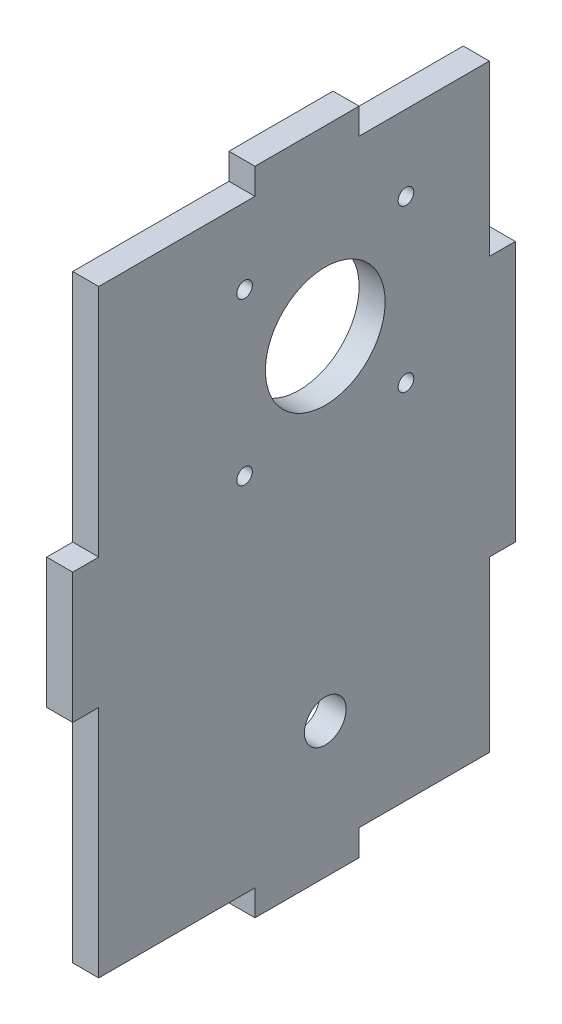
ISO-10303-21;
HEADER;
FILE_DESCRIPTION(('STEP AP214'),'2;1');
FILE_NAME('part.step','',(''),(''),'','','');
FILE_SCHEMA(('AUTOMOTIVE_DESIGN { 1 0 10303 214 1 1 1 1 }'));
ENDSEC;
DATA;
#1=APPLICATION_CONTEXT('core data for automotive mechanical design processes');
#2=APPLICATION_PROTOCOL_DEFINITION('international standard','automotive_design',2000,#1);
#3=PRODUCT_CONTEXT('',#1,'mechanical');
#4=PRODUCT('Part','Part','',(#3));
#5=PRODUCT_RELATED_PRODUCT_CATEGORY('part','',(#4));
#6=PRODUCT_DEFINITION_FORMATION('','',#4);
#7=PRODUCT_DEFINITION_CONTEXT('part definition',#1,'design');
#8=PRODUCT_DEFINITION('design','',#6,#7);
#9=PRODUCT_DEFINITION_SHAPE('','',#8);
#10=(LENGTH_UNIT() NAMED_UNIT(*) SI_UNIT(.MILLI.,.METRE.));
#11=(NAMED_UNIT(*) PLANE_ANGLE_UNIT() SI_UNIT($,.RADIAN.));
#12=(NAMED_UNIT(*) SI_UNIT($,.STERADIAN.) SOLID_ANGLE_UNIT());
#13=UNCERTAINTY_MEASURE_WITH_UNIT(LENGTH_MEASURE(1.E-05),#10,'distance_accuracy_value','');
#14=(GEOMETRIC_REPRESENTATION_CONTEXT(3) GLOBAL_UNCERTAINTY_ASSIGNED_CONTEXT((#13)) GLOBAL_UNIT_ASSIGNED_CONTEXT((#10,
#11,#12)) REPRESENTATION_CONTEXT('',''));
#15=CARTESIAN_POINT('',(0.,0.,0.));
#16=DIRECTION('',(0.,0.,1.));
#17=DIRECTION('',(1.,0.,0.));
#18=AXIS2_PLACEMENT_3D('',#15,#16,#17);
#19=CARTESIAN_POINT('',(5.,0.,0.));
#20=DIRECTION('',(-1.,0.,0.));
#21=DIRECTION('',(0.,0.,1.));
#22=AXIS2_PLACEMENT_3D('',#19,#20,#21);
#23=PLANE('',#22);
#24=DIRECTION('',(0.,0.,1.));
#25=VECTOR('',#24,1.);
#26=CARTESIAN_POINT('',(5.,115.,50.));
#27=LINE('',#26,#25);
#28=CARTESIAN_POINT('',(5.,115.,50.));
#29=VERTEX_POINT('',#28);
#30=CARTESIAN_POINT('',(5.,115.,80.));
#31=VERTEX_POINT('',#30);
#32=EDGE_CURVE('E242',#29,#31,#27,.T.);
#33=ORIENTED_EDGE('',*,*,#32,.T.);
#34=DIRECTION('',(0.,-1.,0.));
#35=VECTOR('',#34,1.);
#36=CARTESIAN_POINT('',(5.,70.,80.));
#37=LINE('',#36,#35);
#38=CARTESIAN_POINT('',(5.,70.,80.));
#39=VERTEX_POINT('',#38);
#40=EDGE_CURVE('E130',#31,#39,#37,.T.);
#41=ORIENTED_EDGE('',*,*,#40,.T.);
#42=DIRECTION('',(0.,0.,1.));
#43=VECTOR('',#42,1.);
#44=CARTESIAN_POINT('',(5.,70.,80.));
#45=LINE('',#44,#43);
#46=CARTESIAN_POINT('',(5.,70.,85.));
#47=VERTEX_POINT('',#46);
#48=EDGE_CURVE('E293',#39,#47,#45,.T.);
#49=ORIENTED_EDGE('',*,*,#48,.T.);
#50=DIRECTION('',(0.,-1.,0.));
#51=VECTOR('',#50,1.);
#52=CARTESIAN_POINT('',(5.,70.,85.));
#53=LINE('',#52,#51);
#54=CARTESIAN_POINT('',(5.,45.,85.));
#55=VERTEX_POINT('',#54);
#56=EDGE_CURVE('E312',#47,#55,#53,.T.);
#57=ORIENTED_EDGE('',*,*,#56,.T.);
#58=DIRECTION('',(0.,0.,-1.));
#59=VECTOR('',#58,1.);
#60=CARTESIAN_POINT('',(5.,45.,80.));
#61=LINE('',#60,#59);
#62=CARTESIAN_POINT('',(5.,45.,80.));
#63=VERTEX_POINT('',#62);
#64=EDGE_CURVE('E309',#55,#63,#61,.T.);
#65=ORIENTED_EDGE('',*,*,#64,.T.);
#66=DIRECTION('',(0.,-1.,0.));
#67=VECTOR('',#66,1.);
#68=CARTESIAN_POINT('',(5.,0.,80.));
#69=LINE('',#68,#67);
#70=CARTESIAN_POINT('',(5.,0.,80.));
#71=VERTEX_POINT('',#70);
#72=EDGE_CURVE('E311',#63,#71,#69,.T.);
#73=ORIENTED_EDGE('',*,*,#72,.T.);
#74=DIRECTION('',(0.,0.,-1.));
#75=VECTOR('',#74,1.);
#76=CARTESIAN_POINT('',(5.,0.,50.));
#77=LINE('',#76,#75);
#78=CARTESIAN_POINT('',(5.,0.,50.));
#79=VERTEX_POINT('',#78);
#80=EDGE_CURVE('E314',#71,#79,#77,.T.);
#81=ORIENTED_EDGE('',*,*,#80,.T.);
#82=DIRECTION('',(0.,-1.,0.));
#83=VECTOR('',#82,1.);
#84=CARTESIAN_POINT('',(5.,0.,50.));
#85=LINE('',#84,#83);
#86=CARTESIAN_POINT('',(5.,-5.,50.));
#87=VERTEX_POINT('',#86);
#88=EDGE_CURVE('E320',#79,#87,#85,.T.);
#89=ORIENTED_EDGE('',*,*,#88,.T.);
#90=DIRECTION('',(0.,0.,-1.));
#91=VECTOR('',#90,1.);
#92=CARTESIAN_POINT('',(5.,-5.,30.));
#93=LINE('',#92,#91);
#94=CARTESIAN_POINT('',(5.,-5.,30.));
#95=VERTEX_POINT('',#94);
#96=EDGE_CURVE('E322',#87,#95,#93,.T.);
#97=ORIENTED_EDGE('',*,*,#96,.T.);
#98=DIRECTION('',(0.,1.,0.));
#99=VECTOR('',#98,1.);
#100=CARTESIAN_POINT('',(5.,0.,30.));
#101=LINE('',#100,#99);
#102=CARTESIAN_POINT('',(5.,0.,30.));
#103=VERTEX_POINT('',#102);
#104=EDGE_CURVE('E324',#95,#103,#101,.T.);
#105=ORIENTED_EDGE('',*,*,#104,.T.);
#106=DIRECTION('',(0.,0.,-1.));
#107=VECTOR('',#106,1.);
#108=CARTESIAN_POINT('',(5.,0.,4.99999999999999));
#109=LINE('',#108,#107);
#110=CARTESIAN_POINT('',(5.,0.,4.99999999999999));
#111=VERTEX_POINT('',#110);
#112=EDGE_CURVE('E326',#103,#111,#109,.T.);
#113=ORIENTED_EDGE('',*,*,#112,.T.);
#114=DIRECTION('',(0.,1.,0.));
#115=VECTOR('',#114,1.);
#116=CARTESIAN_POINT('',(5.,32.5,5.));
#117=LINE('',#116,#115);
#118=CARTESIAN_POINT('',(5.,32.5,5.));
#119=VERTEX_POINT('',#118);
#120=EDGE_CURVE('E328',#111,#119,#117,.T.);
#121=ORIENTED_EDGE('',*,*,#120,.T.);
#122=DIRECTION('',(0.,0.,-1.));
#123=VECTOR('',#122,1.);
#124=CARTESIAN_POINT('',(5.,32.5,0.));
#125=LINE('',#124,#123);
#126=CARTESIAN_POINT('',(5.,32.5,0.));
#127=VERTEX_POINT('',#126);
#128=EDGE_CURVE('E330',#119,#127,#125,.T.);
#129=ORIENTED_EDGE('',*,*,#128,.T.);
#130=DIRECTION('',(0.,1.,0.));
#131=VECTOR('',#130,1.);
#132=CARTESIAN_POINT('',(5.,32.5,0.));
#133=LINE('',#132,#131);
#134=CARTESIAN_POINT('',(5.,82.5,0.));
#135=VERTEX_POINT('',#134);
#136=EDGE_CURVE('E332',#127,#135,#133,.T.);
#137=ORIENTED_EDGE('',*,*,#136,.T.);
#138=DIRECTION('',(0.,0.,1.));
#139=VECTOR('',#138,1.);
#140=CARTESIAN_POINT('',(5.,82.5,0.));
#141=LINE('',#140,#139);
#142=CARTESIAN_POINT('',(5.,82.5,5.));
#143=VERTEX_POINT('',#142);
#144=EDGE_CURVE('E334',#135,#143,#141,.T.);
#145=ORIENTED_EDGE('',*,*,#144,.T.);
#146=DIRECTION('',(0.,1.,0.));
#147=VECTOR('',#146,1.);
#148=CARTESIAN_POINT('',(5.,82.5,5.));
#149=LINE('',#148,#147);
#150=CARTESIAN_POINT('',(5.,115.,5.));
#151=VERTEX_POINT('',#150);
#152=EDGE_CURVE('E336',#143,#151,#149,.T.);
#153=ORIENTED_EDGE('',*,*,#152,.T.);
#154=DIRECTION('',(0.,0.,1.));
#155=VECTOR('',#154,1.);
#156=CARTESIAN_POINT('',(5.,115.,5.));
#157=LINE('',#156,#155);
#158=CARTESIAN_POINT('',(5.,115.,30.));
#159=VERTEX_POINT('',#158);
#160=EDGE_CURVE('E185',#151,#159,#157,.T.);
#161=ORIENTED_EDGE('',*,*,#160,.T.);
#162=DIRECTION('',(0.,1.,0.));
#163=VECTOR('',#162,1.);
#164=CARTESIAN_POINT('',(5.,115.,30.));
#165=LINE('',#164,#163);
#166=CARTESIAN_POINT('',(5.,120.,30.));
#167=VERTEX_POINT('',#166);
#168=EDGE_CURVE('E179',#159,#167,#165,.T.);
#169=ORIENTED_EDGE('',*,*,#168,.T.);
#170=DIRECTION('',(0.,0.,1.));
#171=VECTOR('',#170,1.);
#172=CARTESIAN_POINT('',(5.,120.,30.));
#173=LINE('',#172,#171);
#174=CARTESIAN_POINT('',(5.,120.,50.));
#175=VERTEX_POINT('',#174);
#176=EDGE_CURVE('E183',#167,#175,#173,.T.);
#177=ORIENTED_EDGE('',*,*,#176,.T.);
#178=DIRECTION('',(0.,-1.,0.));
#179=VECTOR('',#178,1.);
#180=CARTESIAN_POINT('',(5.,115.,50.));
#181=LINE('',#180,#179);
#182=EDGE_CURVE('E51',#175,#29,#181,.T.);
#183=ORIENTED_EDGE('',*,*,#182,.T.);
#184=EDGE_LOOP('',(#33,#41,#49,#57,#65,#73,#81,#89,#97,#105,#113,#121,#129,#137,#145,#153,#161,
#169,#177,#183));
#185=FACE_BOUND('',#184,.T.);
#186=CARTESIAN_POINT('',(5.,21.,36.5));
#187=DIRECTION('',(1.,0.,0.));
#188=DIRECTION('',(0.,0.,-1.));
#189=AXIS2_PLACEMENT_3D('',#186,#187,#188);
#190=CIRCLE('',#189,4.00000000000001);
#191=CARTESIAN_POINT('',(5.,21.,32.5));
#192=VERTEX_POINT('',#191);
#193=EDGE_CURVE('E207',#192,#192,#190,.T.);
#194=ORIENTED_EDGE('',*,*,#193,.F.);
#195=EDGE_LOOP('',(#194));
#196=FACE_BOUND('',#195,.T.);
#197=CARTESIAN_POINT('',(5.,85.,36.5));
#198=DIRECTION('',(1.,0.,0.));
#199=DIRECTION('',(0.,0.,-1.));
#200=AXIS2_PLACEMENT_3D('',#197,#198,#199);
#201=CIRCLE('',#200,11.5);
#202=CARTESIAN_POINT('',(5.,85.,25.));
#203=VERTEX_POINT('',#202);
#204=EDGE_CURVE('E420',#203,#203,#201,.T.);
#205=ORIENTED_EDGE('',*,*,#204,.F.);
#206=EDGE_LOOP('',(#205));
#207=FACE_BOUND('',#206,.T.);
#208=CARTESIAN_POINT('',(5.,100.5,52.));
#209=DIRECTION('',(1.,0.,0.));
#210=DIRECTION('',(0.,0.,-1.));
#211=AXIS2_PLACEMENT_3D('',#208,#209,#210);
#212=CIRCLE('',#211,1.5);
#213=CARTESIAN_POINT('',(5.,100.5,50.5));
#214=VERTEX_POINT('',#213);
#215=EDGE_CURVE('E414',#214,#214,#212,.T.);
#216=ORIENTED_EDGE('',*,*,#215,.F.);
#217=EDGE_LOOP('',(#216));
#218=FACE_BOUND('',#217,.T.);
#219=CARTESIAN_POINT('',(5.,100.5,21.));
#220=DIRECTION('',(1.,0.,0.));
#221=DIRECTION('',(0.,0.,-1.));
#222=AXIS2_PLACEMENT_3D('',#219,#220,#221);
#223=CIRCLE('',#222,1.5);
#224=CARTESIAN_POINT('',(5.,100.5,19.5));
#225=VERTEX_POINT('',#224);
#226=EDGE_CURVE('E408',#225,#225,#223,.T.);
#227=ORIENTED_EDGE('',*,*,#226,.F.);
#228=EDGE_LOOP('',(#227));
#229=FACE_BOUND('',#228,.T.);
#230=CARTESIAN_POINT('',(5.,69.5,21.));
#231=DIRECTION('',(1.,0.,0.));
#232=DIRECTION('',(0.,0.,-1.));
#233=AXIS2_PLACEMENT_3D('',#230,#231,#232);
#234=CIRCLE('',#233,1.5);
#235=CARTESIAN_POINT('',(5.,69.5,19.5));
#236=VERTEX_POINT('',#235);
#237=EDGE_CURVE('E402',#236,#236,#234,.T.);
#238=ORIENTED_EDGE('',*,*,#237,.F.);
#239=EDGE_LOOP('',(#238));
#240=FACE_BOUND('',#239,.T.);
#241=CARTESIAN_POINT('',(5.,69.5,52.));
#242=DIRECTION('',(1.,0.,0.));
#243=DIRECTION('',(0.,0.,-1.));
#244=AXIS2_PLACEMENT_3D('',#241,#242,#243);
#245=CIRCLE('',#244,1.5);
#246=CARTESIAN_POINT('',(5.,69.5,50.5));
#247=VERTEX_POINT('',#246);
#248=EDGE_CURVE('E393',#247,#247,#245,.T.);
#249=ORIENTED_EDGE('',*,*,#248,.F.);
#250=EDGE_LOOP('',(#249));
#251=FACE_BOUND('',#250,.T.);
#252=ADVANCED_FACE('F34',(#185,#196,#207,#218,#229,#240,#251),#23,.F.);
#253=CARTESIAN_POINT('',(0.,0.,0.));
#254=DIRECTION('',(-1.,0.,0.));
#255=DIRECTION('',(0.,0.,1.));
#256=AXIS2_PLACEMENT_3D('',#253,#254,#255);
#257=PLANE('',#256);
#258=CARTESIAN_POINT('',(0.,69.5,21.));
#259=DIRECTION('',(1.,0.,0.));
#260=DIRECTION('',(0.,0.,-1.));
#261=AXIS2_PLACEMENT_3D('',#258,#259,#260);
#262=CIRCLE('',#261,1.5);
#263=CARTESIAN_POINT('',(0.,69.5,19.5));
#264=VERTEX_POINT('',#263);
#265=EDGE_CURVE('E399',#264,#264,#262,.T.);
#266=ORIENTED_EDGE('',*,*,#265,.T.);
#267=EDGE_LOOP('',(#266));
#268=FACE_BOUND('',#267,.T.);
#269=CARTESIAN_POINT('',(0.,100.5,52.));
#270=DIRECTION('',(1.,0.,0.));
#271=DIRECTION('',(0.,0.,-1.));
#272=AXIS2_PLACEMENT_3D('',#269,#270,#271);
#273=CIRCLE('',#272,1.5);
#274=CARTESIAN_POINT('',(0.,100.5,50.5));
#275=VERTEX_POINT('',#274);
#276=EDGE_CURVE('E411',#275,#275,#273,.T.);
#277=ORIENTED_EDGE('',*,*,#276,.T.);
#278=EDGE_LOOP('',(#277));
#279=FACE_BOUND('',#278,.T.);
#280=CARTESIAN_POINT('',(0.,21.,36.5));
#281=DIRECTION('',(1.,0.,0.));
#282=DIRECTION('',(0.,0.,-1.));
#283=AXIS2_PLACEMENT_3D('',#280,#281,#282);
#284=CIRCLE('',#283,4.00000000000001);
#285=CARTESIAN_POINT('',(0.,21.,32.5));
#286=VERTEX_POINT('',#285);
#287=EDGE_CURVE('E423',#286,#286,#284,.T.);
#288=ORIENTED_EDGE('',*,*,#287,.T.);
#289=EDGE_LOOP('',(#288));
#290=FACE_BOUND('',#289,.T.);
#291=DIRECTION('',(0.,0.,1.));
#292=VECTOR('',#291,1.);
#293=CARTESIAN_POINT('',(0.,115.,50.));
#294=LINE('',#293,#292);
#295=CARTESIAN_POINT('',(0.,115.,50.));
#296=VERTEX_POINT('',#295);
#297=CARTESIAN_POINT('',(0.,115.,80.));
#298=VERTEX_POINT('',#297);
#299=EDGE_CURVE('E203',#296,#298,#294,.T.);
#300=ORIENTED_EDGE('',*,*,#299,.F.);
#301=DIRECTION('',(0.,-1.,0.));
#302=VECTOR('',#301,1.);
#303=CARTESIAN_POINT('',(0.,115.,50.));
#304=LINE('',#303,#302);
#305=CARTESIAN_POINT('',(0.,120.,50.));
#306=VERTEX_POINT('',#305);
#307=EDGE_CURVE('E122',#306,#296,#304,.T.);
#308=ORIENTED_EDGE('',*,*,#307,.F.);
#309=DIRECTION('',(0.,0.,1.));
#310=VECTOR('',#309,1.);
#311=CARTESIAN_POINT('',(0.,120.,30.));
#312=LINE('',#311,#310);
#313=CARTESIAN_POINT('',(0.,120.,30.));
#314=VERTEX_POINT('',#313);
#315=EDGE_CURVE('E116',#314,#306,#312,.T.);
#316=ORIENTED_EDGE('',*,*,#315,.F.);
#317=DIRECTION('',(0.,1.,0.));
#318=VECTOR('',#317,1.);
#319=CARTESIAN_POINT('',(0.,115.,30.));
#320=LINE('',#319,#318);
#321=CARTESIAN_POINT('',(0.,115.,30.));
#322=VERTEX_POINT('',#321);
#323=EDGE_CURVE('E193',#322,#314,#320,.T.);
#324=ORIENTED_EDGE('',*,*,#323,.F.);
#325=DIRECTION('',(0.,0.,1.));
#326=VECTOR('',#325,1.);
#327=CARTESIAN_POINT('',(0.,115.,5.));
#328=LINE('',#327,#326);
#329=CARTESIAN_POINT('',(0.,115.,5.));
#330=VERTEX_POINT('',#329);
#331=EDGE_CURVE('E237',#330,#322,#328,.T.);
#332=ORIENTED_EDGE('',*,*,#331,.F.);
#333=DIRECTION('',(0.,1.,0.));
#334=VECTOR('',#333,1.);
#335=CARTESIAN_POINT('',(0.,82.5,5.));
#336=LINE('',#335,#334);
#337=CARTESIAN_POINT('',(0.,82.5,5.));
#338=VERTEX_POINT('',#337);
#339=EDGE_CURVE('E235',#338,#330,#336,.T.);
#340=ORIENTED_EDGE('',*,*,#339,.F.);
#341=DIRECTION('',(0.,0.,1.));
#342=VECTOR('',#341,1.);
#343=CARTESIAN_POINT('',(0.,82.5,0.));
#344=LINE('',#343,#342);
#345=CARTESIAN_POINT('',(0.,82.5,0.));
#346=VERTEX_POINT('',#345);
#347=EDGE_CURVE('E233',#346,#338,#344,.T.);
#348=ORIENTED_EDGE('',*,*,#347,.F.);
#349=DIRECTION('',(0.,1.,0.));
#350=VECTOR('',#349,1.);
#351=CARTESIAN_POINT('',(0.,32.5,0.));
#352=LINE('',#351,#350);
#353=CARTESIAN_POINT('',(0.,32.5,0.));
#354=VERTEX_POINT('',#353);
#355=EDGE_CURVE('E231',#354,#346,#352,.T.);
#356=ORIENTED_EDGE('',*,*,#355,.F.);
#357=DIRECTION('',(0.,0.,-1.));
#358=VECTOR('',#357,1.);
#359=CARTESIAN_POINT('',(0.,32.5,0.));
#360=LINE('',#359,#358);
#361=CARTESIAN_POINT('',(0.,32.5,5.));
#362=VERTEX_POINT('',#361);
#363=EDGE_CURVE('E229',#362,#354,#360,.T.);
#364=ORIENTED_EDGE('',*,*,#363,.F.);
#365=DIRECTION('',(0.,1.,0.));
#366=VECTOR('',#365,1.);
#367=CARTESIAN_POINT('',(0.,32.5,5.));
#368=LINE('',#367,#366);
#369=CARTESIAN_POINT('',(0.,0.,4.99999999999999));
#370=VERTEX_POINT('',#369);
#371=EDGE_CURVE('E227',#370,#362,#368,.T.);
#372=ORIENTED_EDGE('',*,*,#371,.F.);
#373=DIRECTION('',(0.,0.,-1.));
#374=VECTOR('',#373,1.);
#375=CARTESIAN_POINT('',(0.,0.,4.99999999999999));
#376=LINE('',#375,#374);
#377=CARTESIAN_POINT('',(0.,0.,30.));
#378=VERTEX_POINT('',#377);
#379=EDGE_CURVE('E225',#378,#370,#376,.T.);
#380=ORIENTED_EDGE('',*,*,#379,.F.);
#381=DIRECTION('',(0.,1.,0.));
#382=VECTOR('',#381,1.);
#383=CARTESIAN_POINT('',(0.,0.,30.));
#384=LINE('',#383,#382);
#385=CARTESIAN_POINT('',(0.,-5.,30.));
#386=VERTEX_POINT('',#385);
#387=EDGE_CURVE('E223',#386,#378,#384,.T.);
#388=ORIENTED_EDGE('',*,*,#387,.F.);
#389=DIRECTION('',(0.,0.,-1.));
#390=VECTOR('',#389,1.);
#391=CARTESIAN_POINT('',(0.,-5.,30.));
#392=LINE('',#391,#390);
#393=CARTESIAN_POINT('',(0.,-5.,50.));
#394=VERTEX_POINT('',#393);
#395=EDGE_CURVE('E221',#394,#386,#392,.T.);
#396=ORIENTED_EDGE('',*,*,#395,.F.);
#397=DIRECTION('',(0.,-1.,0.));
#398=VECTOR('',#397,1.);
#399=CARTESIAN_POINT('',(0.,0.,50.));
#400=LINE('',#399,#398);
#401=CARTESIAN_POINT('',(0.,0.,50.));
#402=VERTEX_POINT('',#401);
#403=EDGE_CURVE('E219',#402,#394,#400,.T.);
#404=ORIENTED_EDGE('',*,*,#403,.F.);
#405=DIRECTION('',(0.,0.,-1.));
#406=VECTOR('',#405,1.);
#407=CARTESIAN_POINT('',(0.,0.,50.));
#408=LINE('',#407,#406);
#409=CARTESIAN_POINT('',(0.,0.,80.));
#410=VERTEX_POINT('',#409);
#411=EDGE_CURVE('E217',#410,#402,#408,.T.);
#412=ORIENTED_EDGE('',*,*,#411,.F.);
#413=DIRECTION('',(0.,-1.,0.));
#414=VECTOR('',#413,1.);
#415=CARTESIAN_POINT('',(0.,0.,80.));
#416=LINE('',#415,#414);
#417=CARTESIAN_POINT('',(0.,45.,80.));
#418=VERTEX_POINT('',#417);
#419=EDGE_CURVE('E215',#418,#410,#416,.T.);
#420=ORIENTED_EDGE('',*,*,#419,.F.);
#421=DIRECTION('',(0.,0.,-1.));
#422=VECTOR('',#421,1.);
#423=CARTESIAN_POINT('',(0.,45.,80.));
#424=LINE('',#423,#422);
#425=CARTESIAN_POINT('',(0.,45.,85.));
#426=VERTEX_POINT('',#425);
#427=EDGE_CURVE('E213',#426,#418,#424,.T.);
#428=ORIENTED_EDGE('',*,*,#427,.F.);
#429=DIRECTION('',(0.,-1.,0.));
#430=VECTOR('',#429,1.);
#431=CARTESIAN_POINT('',(0.,70.,85.));
#432=LINE('',#431,#430);
#433=CARTESIAN_POINT('',(0.,70.,85.));
#434=VERTEX_POINT('',#433);
#435=EDGE_CURVE('E211',#434,#426,#432,.T.);
#436=ORIENTED_EDGE('',*,*,#435,.F.);
#437=DIRECTION('',(0.,0.,1.));
#438=VECTOR('',#437,1.);
#439=CARTESIAN_POINT('',(0.,70.,80.));
#440=LINE('',#439,#438);
#441=CARTESIAN_POINT('',(0.,70.,80.));
#442=VERTEX_POINT('',#441);
#443=EDGE_CURVE('E209',#442,#434,#440,.T.);
#444=ORIENTED_EDGE('',*,*,#443,.F.);
#445=DIRECTION('',(0.,-1.,0.));
#446=VECTOR('',#445,1.);
#447=CARTESIAN_POINT('',(0.,70.,80.));
#448=LINE('',#447,#446);
#449=EDGE_CURVE('E206',#298,#442,#448,.T.);
#450=ORIENTED_EDGE('',*,*,#449,.F.);
#451=EDGE_LOOP('',(#300,#308,#316,#324,#332,#340,#348,#356,#364,#372,#380,#388,#396,#404,#412,
#420,#428,#436,#444,#450));
#452=FACE_BOUND('',#451,.T.);
#453=CARTESIAN_POINT('',(0.,85.,36.5));
#454=DIRECTION('',(1.,0.,0.));
#455=DIRECTION('',(0.,0.,-1.));
#456=AXIS2_PLACEMENT_3D('',#453,#454,#455);
#457=CIRCLE('',#456,11.5);
#458=CARTESIAN_POINT('',(0.,85.,25.));
#459=VERTEX_POINT('',#458);
#460=EDGE_CURVE('E417',#459,#459,#457,.T.);
#461=ORIENTED_EDGE('',*,*,#460,.T.);
#462=EDGE_LOOP('',(#461));
#463=FACE_BOUND('',#462,.T.);
#464=CARTESIAN_POINT('',(0.,100.5,21.));
#465=DIRECTION('',(1.,0.,0.));
#466=DIRECTION('',(0.,0.,-1.));
#467=AXIS2_PLACEMENT_3D('',#464,#465,#466);
#468=CIRCLE('',#467,1.5);
#469=CARTESIAN_POINT('',(0.,100.5,19.5));
#470=VERTEX_POINT('',#469);
#471=EDGE_CURVE('E405',#470,#470,#468,.T.);
#472=ORIENTED_EDGE('',*,*,#471,.T.);
#473=EDGE_LOOP('',(#472));
#474=FACE_BOUND('',#473,.T.);
#475=CARTESIAN_POINT('',(0.,69.5,52.));
#476=DIRECTION('',(1.,0.,0.));
#477=DIRECTION('',(0.,0.,-1.));
#478=AXIS2_PLACEMENT_3D('',#475,#476,#477);
#479=CIRCLE('',#478,1.5);
#480=CARTESIAN_POINT('',(0.,69.5,50.5));
#481=VERTEX_POINT('',#480);
#482=EDGE_CURVE('E396',#481,#481,#479,.T.);
#483=ORIENTED_EDGE('',*,*,#482,.T.);
#484=EDGE_LOOP('',(#483));
#485=FACE_BOUND('',#484,.T.);
#486=ADVANCED_FACE('F297',(#268,#279,#290,#452,#463,#474,#485),#257,.T.);
#487=CARTESIAN_POINT('',(5.,115.,50.));
#488=DIRECTION('',(0.,-1.,0.));
#489=DIRECTION('',(0.,0.,-1.));
#490=AXIS2_PLACEMENT_3D('',#487,#488,#489);
#491=PLANE('',#490);
#492=ORIENTED_EDGE('',*,*,#299,.T.);
#493=DIRECTION('',(-1.,0.,0.));
#494=VECTOR('',#493,1.);
#495=CARTESIAN_POINT('',(5.,115.,80.));
#496=LINE('',#495,#494);
#497=EDGE_CURVE('E11',#31,#298,#496,.T.);
#498=ORIENTED_EDGE('',*,*,#497,.F.);
#499=ORIENTED_EDGE('',*,*,#32,.F.);
#500=DIRECTION('',(-1.,0.,0.));
#501=VECTOR('',#500,1.);
#502=CARTESIAN_POINT('',(5.,115.,50.));
#503=LINE('',#502,#501);
#504=EDGE_CURVE('E199',#29,#296,#503,.T.);
#505=ORIENTED_EDGE('',*,*,#504,.T.);
#506=EDGE_LOOP('',(#492,#498,#499,#505));
#507=FACE_BOUND('',#506,.T.);
#508=ADVANCED_FACE('F36',(#507),#491,.F.);
#509=CARTESIAN_POINT('',(5.,70.,80.));
#510=DIRECTION('',(0.,0.,-1.));
#511=DIRECTION('',(-1.,0.,0.));
#512=AXIS2_PLACEMENT_3D('',#509,#510,#511);
#513=PLANE('',#512);
#514=ORIENTED_EDGE('',*,*,#449,.T.);
#515=DIRECTION('',(-1.,0.,0.));
#516=VECTOR('',#515,1.);
#517=CARTESIAN_POINT('',(5.,70.,80.));
#518=LINE('',#517,#516);
#519=EDGE_CURVE('E43',#39,#442,#518,.T.);
#520=ORIENTED_EDGE('',*,*,#519,.F.);
#521=ORIENTED_EDGE('',*,*,#40,.F.);
#522=ORIENTED_EDGE('',*,*,#497,.T.);
#523=EDGE_LOOP('',(#514,#520,#521,#522));
#524=FACE_BOUND('',#523,.T.);
#525=ADVANCED_FACE('F633',(#524),#513,.F.);
#526=CARTESIAN_POINT('',(5.,70.,80.));
#527=DIRECTION('',(0.,-1.,0.));
#528=DIRECTION('',(0.,0.,-1.));
#529=AXIS2_PLACEMENT_3D('',#526,#527,#528);
#530=PLANE('',#529);
#531=ORIENTED_EDGE('',*,*,#443,.T.);
#532=DIRECTION('',(-1.,0.,0.));
#533=VECTOR('',#532,1.);
#534=CARTESIAN_POINT('',(5.,70.,85.));
#535=LINE('',#534,#533);
#536=EDGE_CURVE('E285',#47,#434,#535,.T.);
#537=ORIENTED_EDGE('',*,*,#536,.F.);
#538=ORIENTED_EDGE('',*,*,#48,.F.);
#539=ORIENTED_EDGE('',*,*,#519,.T.);
#540=EDGE_LOOP('',(#531,#537,#538,#539));
#541=FACE_BOUND('',#540,.T.);
#542=ADVANCED_FACE('F291',(#541),#530,.F.);
#543=CARTESIAN_POINT('',(5.,70.,85.));
#544=DIRECTION('',(0.,0.,-1.));
#545=DIRECTION('',(-1.,0.,0.));
#546=AXIS2_PLACEMENT_3D('',#543,#544,#545);
#547=PLANE('',#546);
#548=ORIENTED_EDGE('',*,*,#435,.T.);
#549=DIRECTION('',(-1.,0.,0.));
#550=VECTOR('',#549,1.);
#551=CARTESIAN_POINT('',(5.,45.,85.));
#552=LINE('',#551,#550);
#553=EDGE_CURVE('E282',#55,#426,#552,.T.);
#554=ORIENTED_EDGE('',*,*,#553,.F.);
#555=ORIENTED_EDGE('',*,*,#56,.F.);
#556=ORIENTED_EDGE('',*,*,#536,.T.);
#557=EDGE_LOOP('',(#548,#554,#555,#556));
#558=FACE_BOUND('',#557,.T.);
#559=ADVANCED_FACE('F303',(#558),#547,.F.);
#560=CARTESIAN_POINT('',(5.,45.,80.));
#561=DIRECTION('',(0.,1.,0.));
#562=DIRECTION('',(0.,0.,1.));
#563=AXIS2_PLACEMENT_3D('',#560,#561,#562);
#564=PLANE('',#563);
#565=ORIENTED_EDGE('',*,*,#427,.T.);
#566=DIRECTION('',(-1.,0.,0.));
#567=VECTOR('',#566,1.);
#568=CARTESIAN_POINT('',(5.,45.,80.));
#569=LINE('',#568,#567);
#570=EDGE_CURVE('E279',#63,#418,#569,.T.);
#571=ORIENTED_EDGE('',*,*,#570,.F.);
#572=ORIENTED_EDGE('',*,*,#64,.F.);
#573=ORIENTED_EDGE('',*,*,#553,.T.);
#574=EDGE_LOOP('',(#565,#571,#572,#573));
#575=FACE_BOUND('',#574,.T.);
#576=ADVANCED_FACE('F307',(#575),#564,.F.);
#577=CARTESIAN_POINT('',(5.,0.,80.));
#578=DIRECTION('',(0.,0.,-1.));
#579=DIRECTION('',(0.,1.,0.));
#580=AXIS2_PLACEMENT_3D('',#577,#578,#579);
#581=PLANE('',#580);
#582=ORIENTED_EDGE('',*,*,#419,.T.);
#583=DIRECTION('',(-1.,0.,0.));
#584=VECTOR('',#583,1.);
#585=CARTESIAN_POINT('',(5.,0.,80.));
#586=LINE('',#585,#584);
#587=EDGE_CURVE('E276',#71,#410,#586,.T.);
#588=ORIENTED_EDGE('',*,*,#587,.F.);
#589=ORIENTED_EDGE('',*,*,#72,.F.);
#590=ORIENTED_EDGE('',*,*,#570,.T.);
#591=EDGE_LOOP('',(#582,#588,#589,#590));
#592=FACE_BOUND('',#591,.T.);
#593=ADVANCED_FACE('F598',(#592),#581,.F.);
#594=CARTESIAN_POINT('',(5.,0.,50.));
#595=DIRECTION('',(0.,1.,0.));
#596=DIRECTION('',(0.,0.,1.));
#597=AXIS2_PLACEMENT_3D('',#594,#595,#596);
#598=PLANE('',#597);
#599=ORIENTED_EDGE('',*,*,#411,.T.);
#600=DIRECTION('',(-1.,0.,0.));
#601=VECTOR('',#600,1.);
#602=CARTESIAN_POINT('',(5.,0.,50.));
#603=LINE('',#602,#601);
#604=EDGE_CURVE('E273',#79,#402,#603,.T.);
#605=ORIENTED_EDGE('',*,*,#604,.F.);
#606=ORIENTED_EDGE('',*,*,#80,.F.);
#607=ORIENTED_EDGE('',*,*,#587,.T.);
#608=EDGE_LOOP('',(#599,#605,#606,#607));
#609=FACE_BOUND('',#608,.T.);
#610=ADVANCED_FACE('F588',(#609),#598,.F.);
#611=CARTESIAN_POINT('',(5.,0.,50.));
#612=DIRECTION('',(0.,0.,-1.));
#613=DIRECTION('',(-1.,0.,0.));
#614=AXIS2_PLACEMENT_3D('',#611,#612,#613);
#615=PLANE('',#614);
#616=ORIENTED_EDGE('',*,*,#403,.T.);
#617=DIRECTION('',(-1.,0.,0.));
#618=VECTOR('',#617,1.);
#619=CARTESIAN_POINT('',(5.,-5.,50.));
#620=LINE('',#619,#618);
#621=EDGE_CURVE('E270',#87,#394,#620,.T.);
#622=ORIENTED_EDGE('',*,*,#621,.F.);
#623=ORIENTED_EDGE('',*,*,#88,.F.);
#624=ORIENTED_EDGE('',*,*,#604,.T.);
#625=EDGE_LOOP('',(#616,#622,#623,#624));
#626=FACE_BOUND('',#625,.T.);
#627=ADVANCED_FACE('F578',(#626),#615,.F.);
#628=CARTESIAN_POINT('',(5.,-5.,30.));
#629=DIRECTION('',(0.,1.,0.));
#630=DIRECTION('',(0.,0.,1.));
#631=AXIS2_PLACEMENT_3D('',#628,#629,#630);
#632=PLANE('',#631);
#633=ORIENTED_EDGE('',*,*,#395,.T.);
#634=DIRECTION('',(-1.,0.,0.));
#635=VECTOR('',#634,1.);
#636=CARTESIAN_POINT('',(5.,-5.,30.));
#637=LINE('',#636,#635);
#638=EDGE_CURVE('E267',#95,#386,#637,.T.);
#639=ORIENTED_EDGE('',*,*,#638,.F.);
#640=ORIENTED_EDGE('',*,*,#96,.F.);
#641=ORIENTED_EDGE('',*,*,#621,.T.);
#642=EDGE_LOOP('',(#633,#639,#640,#641));
#643=FACE_BOUND('',#642,.T.);
#644=ADVANCED_FACE('F568',(#643),#632,.F.);
#645=CARTESIAN_POINT('',(5.,0.,30.));
#646=DIRECTION('',(0.,0.,1.));
#647=DIRECTION('',(1.,0.,0.));
#648=AXIS2_PLACEMENT_3D('',#645,#646,#647);
#649=PLANE('',#648);
#650=ORIENTED_EDGE('',*,*,#387,.T.);
#651=DIRECTION('',(-1.,0.,0.));
#652=VECTOR('',#651,1.);
#653=CARTESIAN_POINT('',(5.,0.,30.));
#654=LINE('',#653,#652);
#655=EDGE_CURVE('E264',#103,#378,#654,.T.);
#656=ORIENTED_EDGE('',*,*,#655,.F.);
#657=ORIENTED_EDGE('',*,*,#104,.F.);
#658=ORIENTED_EDGE('',*,*,#638,.T.);
#659=EDGE_LOOP('',(#650,#656,#657,#658));
#660=FACE_BOUND('',#659,.T.);
#661=ADVANCED_FACE('F558',(#660),#649,.F.);
#662=CARTESIAN_POINT('',(5.,0.,4.99999999999999));
#663=DIRECTION('',(0.,1.,0.));
#664=DIRECTION('',(0.,0.,1.));
#665=AXIS2_PLACEMENT_3D('',#662,#663,#664);
#666=PLANE('',#665);
#667=ORIENTED_EDGE('',*,*,#379,.T.);
#668=DIRECTION('',(-1.,0.,0.));
#669=VECTOR('',#668,1.);
#670=CARTESIAN_POINT('',(5.,0.,4.99999999999999));
#671=LINE('',#670,#669);
#672=EDGE_CURVE('E261',#111,#370,#671,.T.);
#673=ORIENTED_EDGE('',*,*,#672,.F.);
#674=ORIENTED_EDGE('',*,*,#112,.F.);
#675=ORIENTED_EDGE('',*,*,#655,.T.);
#676=EDGE_LOOP('',(#667,#673,#674,#675));
#677=FACE_BOUND('',#676,.T.);
#678=ADVANCED_FACE('F548',(#677),#666,.F.);
#679=CARTESIAN_POINT('',(5.,32.5,5.));
#680=DIRECTION('',(0.,0.,1.));
#681=DIRECTION('',(0.,-1.,0.));
#682=AXIS2_PLACEMENT_3D('',#679,#680,#681);
#683=PLANE('',#682);
#684=ORIENTED_EDGE('',*,*,#371,.T.);
#685=DIRECTION('',(-1.,0.,0.));
#686=VECTOR('',#685,1.);
#687=CARTESIAN_POINT('',(5.,32.5,5.));
#688=LINE('',#687,#686);
#689=EDGE_CURVE('E258',#119,#362,#688,.T.);
#690=ORIENTED_EDGE('',*,*,#689,.F.);
#691=ORIENTED_EDGE('',*,*,#120,.F.);
#692=ORIENTED_EDGE('',*,*,#672,.T.);
#693=EDGE_LOOP('',(#684,#690,#691,#692));
#694=FACE_BOUND('',#693,.T.);
#695=ADVANCED_FACE('F538',(#694),#683,.F.);
#696=CARTESIAN_POINT('',(5.,32.5,0.));
#697=DIRECTION('',(0.,1.,0.));
#698=DIRECTION('',(0.,0.,1.));
#699=AXIS2_PLACEMENT_3D('',#696,#697,#698);
#700=PLANE('',#699);
#701=ORIENTED_EDGE('',*,*,#363,.T.);
#702=DIRECTION('',(-1.,0.,0.));
#703=VECTOR('',#702,1.);
#704=CARTESIAN_POINT('',(5.,32.5,0.));
#705=LINE('',#704,#703);
#706=EDGE_CURVE('E255',#127,#354,#705,.T.);
#707=ORIENTED_EDGE('',*,*,#706,.F.);
#708=ORIENTED_EDGE('',*,*,#128,.F.);
#709=ORIENTED_EDGE('',*,*,#689,.T.);
#710=EDGE_LOOP('',(#701,#707,#708,#709));
#711=FACE_BOUND('',#710,.T.);
#712=ADVANCED_FACE('F528',(#711),#700,.F.);
#713=CARTESIAN_POINT('',(5.,32.5,0.));
#714=DIRECTION('',(0.,0.,1.));
#715=DIRECTION('',(1.,0.,0.));
#716=AXIS2_PLACEMENT_3D('',#713,#714,#715);
#717=PLANE('',#716);
#718=ORIENTED_EDGE('',*,*,#355,.T.);
#719=DIRECTION('',(-1.,0.,0.));
#720=VECTOR('',#719,1.);
#721=CARTESIAN_POINT('',(5.,82.5,0.));
#722=LINE('',#721,#720);
#723=EDGE_CURVE('E252',#135,#346,#722,.T.);
#724=ORIENTED_EDGE('',*,*,#723,.F.);
#725=ORIENTED_EDGE('',*,*,#136,.F.);
#726=ORIENTED_EDGE('',*,*,#706,.T.);
#727=EDGE_LOOP('',(#718,#724,#725,#726));
#728=FACE_BOUND('',#727,.T.);
#729=ADVANCED_FACE('F518',(#728),#717,.F.);
#730=CARTESIAN_POINT('',(5.,82.5,0.));
#731=DIRECTION('',(0.,-1.,0.));
#732=DIRECTION('',(0.,0.,-1.));
#733=AXIS2_PLACEMENT_3D('',#730,#731,#732);
#734=PLANE('',#733);
#735=ORIENTED_EDGE('',*,*,#347,.T.);
#736=DIRECTION('',(-1.,0.,0.));
#737=VECTOR('',#736,1.);
#738=CARTESIAN_POINT('',(5.,82.5,5.));
#739=LINE('',#738,#737);
#740=EDGE_CURVE('E249',#143,#338,#739,.T.);
#741=ORIENTED_EDGE('',*,*,#740,.F.);
#742=ORIENTED_EDGE('',*,*,#144,.F.);
#743=ORIENTED_EDGE('',*,*,#723,.T.);
#744=EDGE_LOOP('',(#735,#741,#742,#743));
#745=FACE_BOUND('',#744,.T.);
#746=ADVANCED_FACE('F509',(#745),#734,.F.);
#747=CARTESIAN_POINT('',(5.,82.5,5.));
#748=DIRECTION('',(0.,0.,1.));
#749=DIRECTION('',(1.,0.,0.));
#750=AXIS2_PLACEMENT_3D('',#747,#748,#749);
#751=PLANE('',#750);
#752=ORIENTED_EDGE('',*,*,#339,.T.);
#753=DIRECTION('',(-1.,0.,0.));
#754=VECTOR('',#753,1.);
#755=CARTESIAN_POINT('',(5.,115.,5.));
#756=LINE('',#755,#754);
#757=EDGE_CURVE('E246',#151,#330,#756,.T.);
#758=ORIENTED_EDGE('',*,*,#757,.F.);
#759=ORIENTED_EDGE('',*,*,#152,.F.);
#760=ORIENTED_EDGE('',*,*,#740,.T.);
#761=EDGE_LOOP('',(#752,#758,#759,#760));
#762=FACE_BOUND('',#761,.T.);
#763=ADVANCED_FACE('F342',(#762),#751,.F.);
#764=CARTESIAN_POINT('',(5.,115.,5.));
#765=DIRECTION('',(0.,-1.,0.));
#766=DIRECTION('',(0.,0.,-1.));
#767=AXIS2_PLACEMENT_3D('',#764,#765,#766);
#768=PLANE('',#767);
#769=ORIENTED_EDGE('',*,*,#331,.T.);
#770=DIRECTION('',(-1.,0.,0.));
#771=VECTOR('',#770,1.);
#772=CARTESIAN_POINT('',(5.,115.,30.));
#773=LINE('',#772,#771);
#774=EDGE_CURVE('E194',#159,#322,#773,.T.);
#775=ORIENTED_EDGE('',*,*,#774,.F.);
#776=ORIENTED_EDGE('',*,*,#160,.F.);
#777=ORIENTED_EDGE('',*,*,#757,.T.);
#778=EDGE_LOOP('',(#769,#775,#776,#777));
#779=FACE_BOUND('',#778,.T.);
#780=ADVANCED_FACE('F346',(#779),#768,.F.);
#781=CARTESIAN_POINT('',(5.,115.,30.));
#782=DIRECTION('',(0.,0.,1.));
#783=DIRECTION('',(1.,0.,0.));
#784=AXIS2_PLACEMENT_3D('',#781,#782,#783);
#785=PLANE('',#784);
#786=ORIENTED_EDGE('',*,*,#323,.T.);
#787=DIRECTION('',(-1.,0.,0.));
#788=VECTOR('',#787,1.);
#789=CARTESIAN_POINT('',(5.,120.,30.));
#790=LINE('',#789,#788);
#791=EDGE_CURVE('E190',#167,#314,#790,.T.);
#792=ORIENTED_EDGE('',*,*,#791,.F.);
#793=ORIENTED_EDGE('',*,*,#168,.F.);
#794=ORIENTED_EDGE('',*,*,#774,.T.);
#795=EDGE_LOOP('',(#786,#792,#793,#794));
#796=FACE_BOUND('',#795,.T.);
#797=ADVANCED_FACE('F191',(#796),#785,.F.);
#798=CARTESIAN_POINT('',(5.,120.,30.));
#799=DIRECTION('',(0.,-1.,0.));
#800=DIRECTION('',(0.,0.,-1.));
#801=AXIS2_PLACEMENT_3D('',#798,#799,#800);
#802=PLANE('',#801);
#803=ORIENTED_EDGE('',*,*,#315,.T.);
#804=DIRECTION('',(-1.,0.,0.));
#805=VECTOR('',#804,1.);
#806=CARTESIAN_POINT('',(5.,120.,50.));
#807=LINE('',#806,#805);
#808=EDGE_CURVE('E195',#175,#306,#807,.T.);
#809=ORIENTED_EDGE('',*,*,#808,.F.);
#810=ORIENTED_EDGE('',*,*,#176,.F.);
#811=ORIENTED_EDGE('',*,*,#791,.T.);
#812=EDGE_LOOP('',(#803,#809,#810,#811));
#813=FACE_BOUND('',#812,.T.);
#814=ADVANCED_FACE('F197',(#813),#802,.F.);
#815=CARTESIAN_POINT('',(5.,115.,50.));
#816=DIRECTION('',(0.,0.,-1.));
#817=DIRECTION('',(-1.,0.,0.));
#818=AXIS2_PLACEMENT_3D('',#815,#816,#817);
#819=PLANE('',#818);
#820=ORIENTED_EDGE('',*,*,#307,.T.);
#821=ORIENTED_EDGE('',*,*,#504,.F.);
#822=ORIENTED_EDGE('',*,*,#182,.F.);
#823=ORIENTED_EDGE('',*,*,#808,.T.);
#824=EDGE_LOOP('',(#820,#821,#822,#823));
#825=FACE_BOUND('',#824,.T.);
#826=ADVANCED_FACE('F350',(#825),#819,.F.);
#827=CARTESIAN_POINT('',(5.,21.,36.5));
#828=DIRECTION('',(-1.,0.,0.));
#829=DIRECTION('',(0.,0.,1.));
#830=AXIS2_PLACEMENT_3D('',#827,#828,#829);
#831=CYLINDRICAL_SURFACE('',#830,4.00000000000001);
#832=ORIENTED_EDGE('',*,*,#193,.T.);
#833=EDGE_LOOP('',(#832));
#834=FACE_BOUND('',#833,.T.);
#835=ORIENTED_EDGE('',*,*,#287,.F.);
#836=EDGE_LOOP('',(#835));
#837=FACE_BOUND('',#836,.T.);
#838=ADVANCED_FACE('F352',(#834,#837),#831,.F.);
#839=CARTESIAN_POINT('',(5.,85.,36.5));
#840=DIRECTION('',(-1.,0.,0.));
#841=DIRECTION('',(0.,0.,1.));
#842=AXIS2_PLACEMENT_3D('',#839,#840,#841);
#843=CYLINDRICAL_SURFACE('',#842,11.5);
#844=ORIENTED_EDGE('',*,*,#204,.T.);
#845=EDGE_LOOP('',(#844));
#846=FACE_BOUND('',#845,.T.);
#847=ORIENTED_EDGE('',*,*,#460,.F.);
#848=EDGE_LOOP('',(#847));
#849=FACE_BOUND('',#848,.T.);
#850=ADVANCED_FACE('F358',(#846,#849),#843,.F.);
#851=CARTESIAN_POINT('',(5.,100.5,52.));
#852=DIRECTION('',(-1.,0.,0.));
#853=DIRECTION('',(0.,0.,1.));
#854=AXIS2_PLACEMENT_3D('',#851,#852,#853);
#855=CYLINDRICAL_SURFACE('',#854,1.5);
#856=ORIENTED_EDGE('',*,*,#215,.T.);
#857=EDGE_LOOP('',(#856));
#858=FACE_BOUND('',#857,.T.);
#859=ORIENTED_EDGE('',*,*,#276,.F.);
#860=EDGE_LOOP('',(#859));
#861=FACE_BOUND('',#860,.T.);
#862=ADVANCED_FACE('F372',(#858,#861),#855,.F.);
#863=CARTESIAN_POINT('',(5.,100.5,21.));
#864=DIRECTION('',(-1.,0.,0.));
#865=DIRECTION('',(0.,0.,1.));
#866=AXIS2_PLACEMENT_3D('',#863,#864,#865);
#867=CYLINDRICAL_SURFACE('',#866,1.5);
#868=ORIENTED_EDGE('',*,*,#226,.T.);
#869=EDGE_LOOP('',(#868));
#870=FACE_BOUND('',#869,.T.);
#871=ORIENTED_EDGE('',*,*,#471,.F.);
#872=EDGE_LOOP('',(#871));
#873=FACE_BOUND('',#872,.T.);
#874=ADVANCED_FACE('F376',(#870,#873),#867,.F.);
#875=CARTESIAN_POINT('',(5.,69.5,21.));
#876=DIRECTION('',(-1.,0.,0.));
#877=DIRECTION('',(0.,0.,1.));
#878=AXIS2_PLACEMENT_3D('',#875,#876,#877);
#879=CYLINDRICAL_SURFACE('',#878,1.5);
#880=ORIENTED_EDGE('',*,*,#237,.T.);
#881=EDGE_LOOP('',(#880));
#882=FACE_BOUND('',#881,.T.);
#883=ORIENTED_EDGE('',*,*,#265,.F.);
#884=EDGE_LOOP('',(#883));
#885=FACE_BOUND('',#884,.T.);
#886=ADVANCED_FACE('F380',(#882,#885),#879,.F.);
#887=CARTESIAN_POINT('',(5.,69.5,52.));
#888=DIRECTION('',(-1.,0.,0.));
#889=DIRECTION('',(0.,0.,1.));
#890=AXIS2_PLACEMENT_3D('',#887,#888,#889);
#891=CYLINDRICAL_SURFACE('',#890,1.5);
#892=ORIENTED_EDGE('',*,*,#248,.T.);
#893=EDGE_LOOP('',(#892));
#894=FACE_BOUND('',#893,.T.);
#895=ORIENTED_EDGE('',*,*,#482,.F.);
#896=EDGE_LOOP('',(#895));
#897=FACE_BOUND('',#896,.T.);
#898=ADVANCED_FACE('F384',(#894,#897),#891,.F.);
#899=CLOSED_SHELL('',(#252,#486,#508,#525,#542,#559,#576,#593,#610,#627,#644,#661,#678,#695,
#712,#729,#746,#763,#780,#797,#814,#826,#838,#850,#862,#874,#886,#898));
#900=MANIFOLD_SOLID_BREP('B2',#899);
#901=ADVANCED_BREP_SHAPE_REPRESENTATION('',(#18,#900),#14);
#902=SHAPE_DEFINITION_REPRESENTATION(#9,#901);
ENDSEC;
END-ISO-10303-21;
